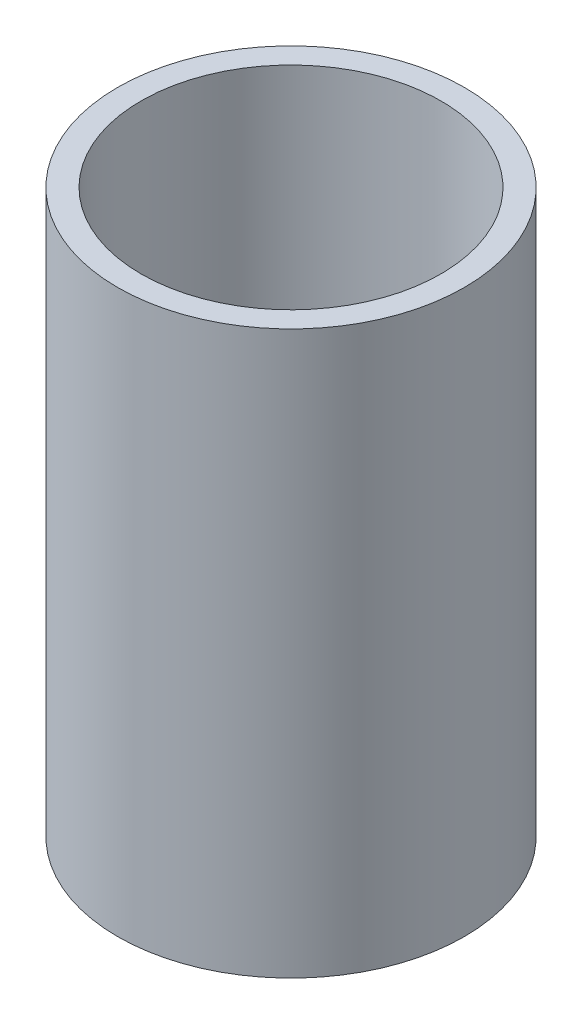
ISO-10303-21;
HEADER;
FILE_DESCRIPTION(('STEP AP214'),'2;1');
FILE_NAME('part.step','',(''),(''),'','','');
FILE_SCHEMA(('AUTOMOTIVE_DESIGN { 1 0 10303 214 1 1 1 1 }'));
ENDSEC;
DATA;
#1=APPLICATION_CONTEXT('core data for automotive mechanical design processes');
#2=APPLICATION_PROTOCOL_DEFINITION('international standard','automotive_design',2000,#1);
#3=PRODUCT_CONTEXT('',#1,'mechanical');
#4=PRODUCT('Part','Part','',(#3));
#5=PRODUCT_RELATED_PRODUCT_CATEGORY('part','',(#4));
#6=PRODUCT_DEFINITION_FORMATION('','',#4);
#7=PRODUCT_DEFINITION_CONTEXT('part definition',#1,'design');
#8=PRODUCT_DEFINITION('design','',#6,#7);
#9=PRODUCT_DEFINITION_SHAPE('','',#8);
#10=(LENGTH_UNIT() NAMED_UNIT(*) SI_UNIT(.MILLI.,.METRE.));
#11=(NAMED_UNIT(*) PLANE_ANGLE_UNIT() SI_UNIT($,.RADIAN.));
#12=(NAMED_UNIT(*) SI_UNIT($,.STERADIAN.) SOLID_ANGLE_UNIT());
#13=UNCERTAINTY_MEASURE_WITH_UNIT(LENGTH_MEASURE(1.E-05),#10,'distance_accuracy_value','');
#14=(GEOMETRIC_REPRESENTATION_CONTEXT(3) GLOBAL_UNCERTAINTY_ASSIGNED_CONTEXT((#13)) GLOBAL_UNIT_ASSIGNED_CONTEXT((#10,
#11,#12)) REPRESENTATION_CONTEXT('',''));
#15=CARTESIAN_POINT('',(0.,0.,0.));
#16=DIRECTION('',(0.,0.,1.));
#17=DIRECTION('',(1.,0.,0.));
#18=AXIS2_PLACEMENT_3D('',#15,#16,#17);
#19=CARTESIAN_POINT('',(0.,30.,0.));
#20=DIRECTION('',(0.,-1.,0.));
#21=DIRECTION('',(0.,0.,-1.));
#22=AXIS2_PLACEMENT_3D('',#19,#20,#21);
#23=CYLINDRICAL_SURFACE('',#22,9.25);
#24=CARTESIAN_POINT('',(0.,30.,0.));
#25=DIRECTION('',(0.,1.,0.));
#26=DIRECTION('',(0.,0.,1.));
#27=AXIS2_PLACEMENT_3D('',#24,#25,#26);
#28=CIRCLE('',#27,9.25);
#29=CARTESIAN_POINT('',(0.,30.,9.25));
#30=VERTEX_POINT('',#29);
#31=EDGE_CURVE('E11',#30,#30,#28,.T.);
#32=ORIENTED_EDGE('',*,*,#31,.F.);
#33=EDGE_LOOP('',(#32));
#34=FACE_BOUND('',#33,.T.);
#35=CARTESIAN_POINT('',(0.,0.,0.));
#36=DIRECTION('',(0.,1.,0.));
#37=DIRECTION('',(0.,0.,1.));
#38=AXIS2_PLACEMENT_3D('',#35,#36,#37);
#39=CIRCLE('',#38,9.25);
#40=CARTESIAN_POINT('',(0.,0.,9.25));
#41=VERTEX_POINT('',#40);
#42=EDGE_CURVE('E44',#41,#41,#39,.T.);
#43=ORIENTED_EDGE('',*,*,#42,.T.);
#44=EDGE_LOOP('',(#43));
#45=FACE_BOUND('',#44,.T.);
#46=ADVANCED_FACE('F37',(#34,#45),#23,.T.);
#47=CARTESIAN_POINT('',(0.,30.,0.));
#48=DIRECTION('',(0.,1.,0.));
#49=DIRECTION('',(0.,0.,1.));
#50=AXIS2_PLACEMENT_3D('',#47,#48,#49);
#51=PLANE('',#50);
#52=CARTESIAN_POINT('',(0.,30.,0.));
#53=DIRECTION('',(0.,1.,0.));
#54=DIRECTION('',(0.,0.,1.));
#55=AXIS2_PLACEMENT_3D('',#52,#53,#54);
#56=CIRCLE('',#55,8.);
#57=CARTESIAN_POINT('',(0.,30.,8.));
#58=VERTEX_POINT('',#57);
#59=EDGE_CURVE('E53',#58,#58,#56,.T.);
#60=ORIENTED_EDGE('',*,*,#59,.F.);
#61=EDGE_LOOP('',(#60));
#62=FACE_BOUND('',#61,.T.);
#63=ORIENTED_EDGE('',*,*,#31,.T.);
#64=EDGE_LOOP('',(#63));
#65=FACE_BOUND('',#64,.T.);
#66=ADVANCED_FACE('F79',(#62,#65),#51,.T.);
#67=CARTESIAN_POINT('',(0.,0.,0.));
#68=DIRECTION('',(0.,1.,0.));
#69=DIRECTION('',(0.,0.,1.));
#70=AXIS2_PLACEMENT_3D('',#67,#68,#69);
#71=PLANE('',#70);
#72=CARTESIAN_POINT('',(0.,0.,0.));
#73=DIRECTION('',(0.,1.,0.));
#74=DIRECTION('',(0.,0.,1.));
#75=AXIS2_PLACEMENT_3D('',#72,#73,#74);
#76=CIRCLE('',#75,2.);
#77=CARTESIAN_POINT('',(0.,0.,2.));
#78=VERTEX_POINT('',#77);
#79=EDGE_CURVE('E56',#78,#78,#76,.T.);
#80=ORIENTED_EDGE('',*,*,#79,.T.);
#81=EDGE_LOOP('',(#80));
#82=FACE_BOUND('',#81,.T.);
#83=ORIENTED_EDGE('',*,*,#42,.F.);
#84=EDGE_LOOP('',(#83));
#85=FACE_BOUND('',#84,.T.);
#86=ADVANCED_FACE('F75',(#82,#85),#71,.F.);
#87=CARTESIAN_POINT('',(0.,-22.6274169979695,0.));
#88=DIRECTION('',(0.,1.,0.));
#89=DIRECTION('',(0.,0.,1.));
#90=AXIS2_PLACEMENT_3D('',#87,#88,#89);
#91=CYLINDRICAL_SURFACE('',#90,8.);
#92=CARTESIAN_POINT('',(0.,2.,0.));
#93=DIRECTION('',(0.,1.,0.));
#94=DIRECTION('',(0.,0.,1.));
#95=AXIS2_PLACEMENT_3D('',#92,#93,#94);
#96=CIRCLE('',#95,8.);
#97=CARTESIAN_POINT('',(0.,2.,8.));
#98=VERTEX_POINT('',#97);
#99=EDGE_CURVE('E49',#98,#98,#96,.F.);
#100=ORIENTED_EDGE('',*,*,#99,.T.);
#101=EDGE_LOOP('',(#100));
#102=FACE_BOUND('',#101,.T.);
#103=ORIENTED_EDGE('',*,*,#59,.T.);
#104=EDGE_LOOP('',(#103));
#105=FACE_BOUND('',#104,.T.);
#106=ADVANCED_FACE('F69',(#102,#105),#91,.F.);
#107=CARTESIAN_POINT('',(0.,2.,0.));
#108=DIRECTION('',(0.,1.,0.));
#109=DIRECTION('',(0.,0.,1.));
#110=AXIS2_PLACEMENT_3D('',#107,#108,#109);
#111=PLANE('',#110);
#112=CARTESIAN_POINT('',(0.,2.,0.));
#113=DIRECTION('',(0.,1.,0.));
#114=DIRECTION('',(0.,0.,1.));
#115=AXIS2_PLACEMENT_3D('',#112,#113,#114);
#116=CIRCLE('',#115,2.);
#117=CARTESIAN_POINT('',(0.,2.,2.));
#118=VERTEX_POINT('',#117);
#119=EDGE_CURVE('E40',#118,#118,#116,.T.);
#120=ORIENTED_EDGE('',*,*,#119,.F.);
#121=EDGE_LOOP('',(#120));
#122=FACE_BOUND('',#121,.T.);
#123=ORIENTED_EDGE('',*,*,#99,.F.);
#124=EDGE_LOOP('',(#123));
#125=FACE_BOUND('',#124,.T.);
#126=ADVANCED_FACE('F66',(#122,#125),#111,.T.);
#127=CARTESIAN_POINT('',(0.,-1.2E-05,0.));
#128=DIRECTION('',(0.,1.,0.));
#129=DIRECTION('',(0.,0.,1.));
#130=AXIS2_PLACEMENT_3D('',#127,#128,#129);
#131=CYLINDRICAL_SURFACE('',#130,2.);
#132=CARTESIAN_POINT('',(0.,2.,2.));
#133=CARTESIAN_POINT('',(0.,1.97916666666667,2.));
#134=CARTESIAN_POINT('',(0.,1.95833333333333,2.));
#135=CARTESIAN_POINT('',(0.,1.91666666666667,2.));
#136=CARTESIAN_POINT('',(0.,1.89583333333333,2.));
#137=CARTESIAN_POINT('',(0.,1.85416666666667,2.));
#138=CARTESIAN_POINT('',(0.,1.83333333333333,2.));
#139=CARTESIAN_POINT('',(0.,1.79166666666667,2.));
#140=CARTESIAN_POINT('',(0.,1.77083333333333,2.));
#141=CARTESIAN_POINT('',(0.,1.72916666666667,2.));
#142=CARTESIAN_POINT('',(0.,1.70833333333333,2.));
#143=CARTESIAN_POINT('',(0.,1.66666666666667,2.));
#144=CARTESIAN_POINT('',(0.,1.64583333333333,2.));
#145=CARTESIAN_POINT('',(0.,1.60416666666667,2.));
#146=CARTESIAN_POINT('',(0.,1.58333333333333,2.));
#147=CARTESIAN_POINT('',(0.,1.54166666666667,2.));
#148=CARTESIAN_POINT('',(0.,1.52083333333333,2.));
#149=CARTESIAN_POINT('',(0.,1.47916666666667,2.));
#150=CARTESIAN_POINT('',(0.,1.45833333333333,2.));
#151=CARTESIAN_POINT('',(0.,1.41666666666667,2.));
#152=CARTESIAN_POINT('',(0.,1.39583333333333,2.));
#153=CARTESIAN_POINT('',(0.,1.35416666666667,2.));
#154=CARTESIAN_POINT('',(0.,1.33333333333333,2.));
#155=CARTESIAN_POINT('',(0.,1.29166666666667,2.));
#156=CARTESIAN_POINT('',(0.,1.27083333333333,2.));
#157=CARTESIAN_POINT('',(0.,1.22916666666667,2.));
#158=CARTESIAN_POINT('',(0.,1.20833333333333,2.));
#159=CARTESIAN_POINT('',(0.,1.16666666666667,2.));
#160=CARTESIAN_POINT('',(0.,1.14583333333333,2.));
#161=CARTESIAN_POINT('',(0.,1.10416666666667,2.));
#162=CARTESIAN_POINT('',(0.,1.08333333333333,2.));
#163=CARTESIAN_POINT('',(0.,1.04166666666667,2.));
#164=CARTESIAN_POINT('',(0.,1.02083333333333,2.));
#165=CARTESIAN_POINT('',(0.,0.979166666666667,2.));
#166=CARTESIAN_POINT('',(0.,0.958333333333334,2.));
#167=CARTESIAN_POINT('',(0.,0.916666666666667,2.));
#168=CARTESIAN_POINT('',(0.,0.895833333333334,2.));
#169=CARTESIAN_POINT('',(0.,0.854166666666667,2.));
#170=CARTESIAN_POINT('',(0.,0.833333333333334,2.));
#171=CARTESIAN_POINT('',(0.,0.791666666666667,2.));
#172=CARTESIAN_POINT('',(0.,0.770833333333334,2.));
#173=CARTESIAN_POINT('',(0.,0.729166666666667,2.));
#174=CARTESIAN_POINT('',(0.,0.708333333333334,2.));
#175=CARTESIAN_POINT('',(0.,0.666666666666667,2.));
#176=CARTESIAN_POINT('',(0.,0.645833333333334,2.));
#177=CARTESIAN_POINT('',(0.,0.604166666666667,2.));
#178=CARTESIAN_POINT('',(0.,0.583333333333333,2.));
#179=CARTESIAN_POINT('',(0.,0.541666666666667,2.));
#180=CARTESIAN_POINT('',(0.,0.520833333333333,2.));
#181=CARTESIAN_POINT('',(0.,0.479166666666667,2.));
#182=CARTESIAN_POINT('',(0.,0.458333333333334,2.));
#183=CARTESIAN_POINT('',(0.,0.416666666666667,2.));
#184=CARTESIAN_POINT('',(0.,0.395833333333334,2.));
#185=CARTESIAN_POINT('',(0.,0.354166666666667,2.));
#186=CARTESIAN_POINT('',(0.,0.333333333333334,2.));
#187=CARTESIAN_POINT('',(0.,0.291666666666667,2.));
#188=CARTESIAN_POINT('',(0.,0.270833333333333,2.));
#189=CARTESIAN_POINT('',(0.,0.229166666666667,2.));
#190=CARTESIAN_POINT('',(0.,0.208333333333333,2.));
#191=CARTESIAN_POINT('',(0.,0.166666666666667,2.));
#192=CARTESIAN_POINT('',(0.,0.145833333333334,2.));
#193=CARTESIAN_POINT('',(0.,0.104166666666667,2.));
#194=CARTESIAN_POINT('',(0.,0.0833333333333336,2.));
#195=CARTESIAN_POINT('',(0.,0.0416666666666669,2.));
#196=CARTESIAN_POINT('',(0.,0.0208333333333335,2.));
#197=CARTESIAN_POINT('',(0.,0.,2.));
#198=B_SPLINE_CURVE_WITH_KNOTS('',3,(#132,#133,#134,#135,#136,#137,#138,#139,#140,#141,#142,
#143,#144,#145,#146,#147,#148,#149,#150,#151,#152,#153,#154,#155,#156,#157,#158,#159,#160,#161,
#162,#163,#164,#165,#166,#167,#168,#169,#170,#171,#172,#173,#174,#175,#176,#177,#178,#179,#180,
#181,#182,#183,#184,#185,#186,#187,#188,#189,#190,#191,#192,#193,#194,#195,#196,#197),
.UNSPECIFIED.,.F.,.F.,(4,2,2,2,2,2,2,2,2,2,2,2,2,2,2,2,2,2,2,2,2,2,2,2,2,2,2,2,2,2,2,2,4),(0.,
0.0624999999999996,0.125,0.1875,0.25,0.3125,0.375,0.4375,0.5,0.5625,0.625,0.6875,0.75,0.8125,
0.875,0.9375,1.,1.0625,1.125,1.1875,1.25,1.3125,1.375,1.4375,1.5,1.5625,1.625,1.6875,1.75,
1.8125,1.875,1.9375,2.),.UNSPECIFIED.);
#199=EDGE_CURVE('BSEAM63',#118,#78,#198,.T.);
#200=ORIENTED_EDGE('',*,*,#119,.T.);
#201=ORIENTED_EDGE('',*,*,#79,.F.);
#202=ORIENTED_EDGE('',*,*,#199,.T.);
#203=ORIENTED_EDGE('',*,*,#199,.F.);
#204=EDGE_LOOP('',(#200,#202,#201,#203));
#205=FACE_BOUND('',#204,.T.);
#206=ADVANCED_FACE('F63',(#205),#131,.F.);
#207=CLOSED_SHELL('',(#46,#66,#86,#106,#126,#206));
#208=MANIFOLD_SOLID_BREP('B2',#207);
#209=ADVANCED_BREP_SHAPE_REPRESENTATION('',(#18,#208),#14);
#210=SHAPE_DEFINITION_REPRESENTATION(#9,#209);
ENDSEC;
END-ISO-10303-21;
